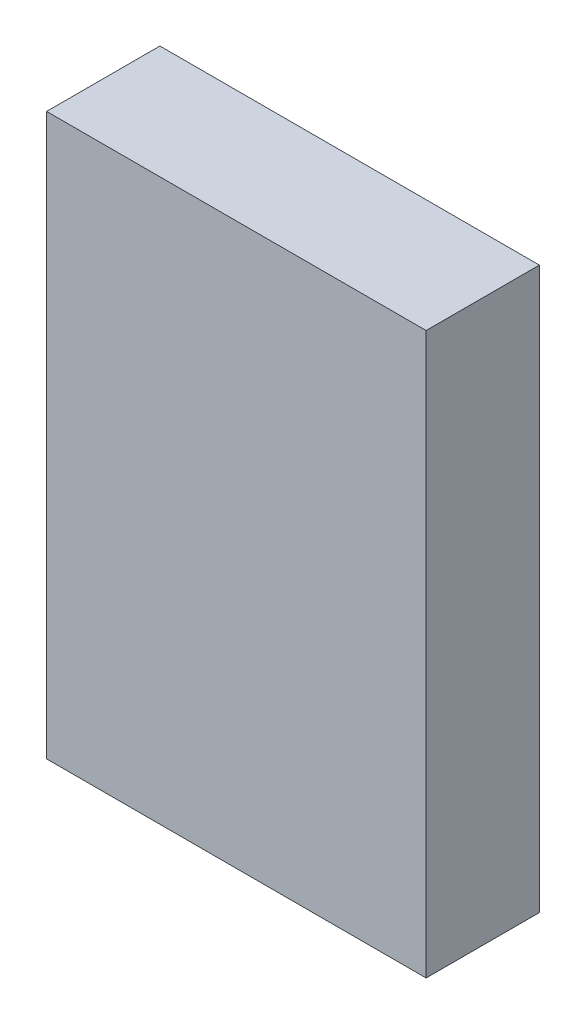
ISO-10303-21;
HEADER;
FILE_DESCRIPTION(('STEP AP214'),'2;1');
FILE_NAME('part.step','',(''),(''),'','','');
FILE_SCHEMA(('AUTOMOTIVE_DESIGN { 1 0 10303 214 1 1 1 1 }'));
ENDSEC;
DATA;
#1=APPLICATION_CONTEXT('core data for automotive mechanical design processes');
#2=APPLICATION_PROTOCOL_DEFINITION('international standard','automotive_design',2000,#1);
#3=PRODUCT_CONTEXT('',#1,'mechanical');
#4=PRODUCT('Part','Part','',(#3));
#5=PRODUCT_RELATED_PRODUCT_CATEGORY('part','',(#4));
#6=PRODUCT_DEFINITION_FORMATION('','',#4);
#7=PRODUCT_DEFINITION_CONTEXT('part definition',#1,'design');
#8=PRODUCT_DEFINITION('design','',#6,#7);
#9=PRODUCT_DEFINITION_SHAPE('','',#8);
#10=(LENGTH_UNIT() NAMED_UNIT(*) SI_UNIT(.MILLI.,.METRE.));
#11=(NAMED_UNIT(*) PLANE_ANGLE_UNIT() SI_UNIT($,.RADIAN.));
#12=(NAMED_UNIT(*) SI_UNIT($,.STERADIAN.) SOLID_ANGLE_UNIT());
#13=UNCERTAINTY_MEASURE_WITH_UNIT(LENGTH_MEASURE(1.E-05),#10,'distance_accuracy_value','');
#14=(GEOMETRIC_REPRESENTATION_CONTEXT(3) GLOBAL_UNCERTAINTY_ASSIGNED_CONTEXT((#13)) GLOBAL_UNIT_ASSIGNED_CONTEXT((#10,
#11,#12)) REPRESENTATION_CONTEXT('',''));
#15=CARTESIAN_POINT('',(0.,0.,0.));
#16=DIRECTION('',(0.,0.,1.));
#17=DIRECTION('',(1.,0.,0.));
#18=AXIS2_PLACEMENT_3D('',#15,#16,#17);
#19=CARTESIAN_POINT('',(23.72,45.32,15.5));
#20=DIRECTION('',(0.,0.,1.));
#21=DIRECTION('',(1.,0.,0.));
#22=AXIS2_PLACEMENT_3D('',#19,#20,#21);
#23=PLANE('',#22);
#24=DIRECTION('',(0.,1.,0.));
#25=VECTOR('',#24,1.);
#26=CARTESIAN_POINT('',(23.72,45.32,15.5));
#27=LINE('',#26,#25);
#28=CARTESIAN_POINT('',(23.72,45.32,15.5));
#29=VERTEX_POINT('',#28);
#30=CARTESIAN_POINT('',(23.72,94.82,15.5));
#31=VERTEX_POINT('',#30);
#32=EDGE_CURVE('E89',#29,#31,#27,.T.);
#33=ORIENTED_EDGE('',*,*,#32,.F.);
#34=DIRECTION('',(1.,0.,0.));
#35=VECTOR('',#34,1.);
#36=CARTESIAN_POINT('',(23.72,45.32,15.5));
#37=LINE('',#36,#35);
#38=CARTESIAN_POINT('',(57.22,45.32,15.5));
#39=VERTEX_POINT('',#38);
#40=EDGE_CURVE('E51',#29,#39,#37,.T.);
#41=ORIENTED_EDGE('',*,*,#40,.T.);
#42=DIRECTION('',(0.,1.,0.));
#43=VECTOR('',#42,1.);
#44=CARTESIAN_POINT('',(57.22,45.32,15.5));
#45=LINE('',#44,#43);
#46=CARTESIAN_POINT('',(57.22,94.82,15.5));
#47=VERTEX_POINT('',#46);
#48=EDGE_CURVE('E82',#39,#47,#45,.T.);
#49=ORIENTED_EDGE('',*,*,#48,.T.);
#50=DIRECTION('',(1.,0.,0.));
#51=VECTOR('',#50,1.);
#52=CARTESIAN_POINT('',(23.72,94.82,15.5));
#53=LINE('',#52,#51);
#54=EDGE_CURVE('E11',#31,#47,#53,.T.);
#55=ORIENTED_EDGE('',*,*,#54,.F.);
#56=EDGE_LOOP('',(#33,#41,#49,#55));
#57=FACE_BOUND('',#56,.T.);
#58=ADVANCED_FACE('F17',(#57),#23,.T.);
#59=CARTESIAN_POINT('',(23.72,45.32,5.5));
#60=DIRECTION('',(0.,0.,1.));
#61=DIRECTION('',(1.,0.,0.));
#62=AXIS2_PLACEMENT_3D('',#59,#60,#61);
#63=PLANE('',#62);
#64=DIRECTION('',(1.,0.,0.));
#65=VECTOR('',#64,1.);
#66=CARTESIAN_POINT('',(23.72,94.82,5.5));
#67=LINE('',#66,#65);
#68=CARTESIAN_POINT('',(23.72,94.82,5.5));
#69=VERTEX_POINT('',#68);
#70=CARTESIAN_POINT('',(57.22,94.82,5.5));
#71=VERTEX_POINT('',#70);
#72=EDGE_CURVE('E20',#69,#71,#67,.T.);
#73=ORIENTED_EDGE('',*,*,#72,.T.);
#74=DIRECTION('',(0.,1.,0.));
#75=VECTOR('',#74,1.);
#76=CARTESIAN_POINT('',(57.22,45.32,5.5));
#77=LINE('',#76,#75);
#78=CARTESIAN_POINT('',(57.22,45.32,5.5));
#79=VERTEX_POINT('',#78);
#80=EDGE_CURVE('E107',#79,#71,#77,.T.);
#81=ORIENTED_EDGE('',*,*,#80,.F.);
#82=DIRECTION('',(1.,0.,0.));
#83=VECTOR('',#82,1.);
#84=CARTESIAN_POINT('',(23.72,45.32,5.5));
#85=LINE('',#84,#83);
#86=CARTESIAN_POINT('',(23.72,45.32,5.5));
#87=VERTEX_POINT('',#86);
#88=EDGE_CURVE('E64',#87,#79,#85,.T.);
#89=ORIENTED_EDGE('',*,*,#88,.F.);
#90=DIRECTION('',(0.,1.,0.));
#91=VECTOR('',#90,1.);
#92=CARTESIAN_POINT('',(23.72,45.32,5.5));
#93=LINE('',#92,#91);
#94=EDGE_CURVE('E93',#87,#69,#93,.T.);
#95=ORIENTED_EDGE('',*,*,#94,.T.);
#96=EDGE_LOOP('',(#73,#81,#89,#95));
#97=FACE_BOUND('',#96,.T.);
#98=ADVANCED_FACE('F120',(#97),#63,.F.);
#99=CARTESIAN_POINT('',(23.72,94.82,5.5));
#100=DIRECTION('',(0.,1.,0.));
#101=DIRECTION('',(1.,0.,0.));
#102=AXIS2_PLACEMENT_3D('',#99,#100,#101);
#103=PLANE('',#102);
#104=ORIENTED_EDGE('',*,*,#72,.F.);
#105=DIRECTION('',(0.,0.,1.));
#106=VECTOR('',#105,1.);
#107=CARTESIAN_POINT('',(23.72,94.82,5.5));
#108=LINE('',#107,#106);
#109=EDGE_CURVE('E92',#69,#31,#108,.T.);
#110=ORIENTED_EDGE('',*,*,#109,.T.);
#111=ORIENTED_EDGE('',*,*,#54,.T.);
#112=DIRECTION('',(0.,0.,1.));
#113=VECTOR('',#112,1.);
#114=CARTESIAN_POINT('',(57.22,94.82,5.5));
#115=LINE('',#114,#113);
#116=EDGE_CURVE('E104',#71,#47,#115,.T.);
#117=ORIENTED_EDGE('',*,*,#116,.F.);
#118=EDGE_LOOP('',(#104,#110,#111,#117));
#119=FACE_BOUND('',#118,.T.);
#120=ADVANCED_FACE('F121',(#119),#103,.T.);
#121=CARTESIAN_POINT('',(23.72,45.32,5.5));
#122=DIRECTION('',(0.,1.,0.));
#123=DIRECTION('',(1.,0.,0.));
#124=AXIS2_PLACEMENT_3D('',#121,#122,#123);
#125=PLANE('',#124);
#126=DIRECTION('',(0.,0.,1.));
#127=VECTOR('',#126,1.);
#128=CARTESIAN_POINT('',(57.22,45.32,5.5));
#129=LINE('',#128,#127);
#130=EDGE_CURVE('E85',#79,#39,#129,.T.);
#131=ORIENTED_EDGE('',*,*,#130,.T.);
#132=ORIENTED_EDGE('',*,*,#40,.F.);
#133=DIRECTION('',(0.,0.,1.));
#134=VECTOR('',#133,1.);
#135=CARTESIAN_POINT('',(23.72,45.32,5.5));
#136=LINE('',#135,#134);
#137=EDGE_CURVE('E78',#87,#29,#136,.T.);
#138=ORIENTED_EDGE('',*,*,#137,.F.);
#139=ORIENTED_EDGE('',*,*,#88,.T.);
#140=EDGE_LOOP('',(#131,#132,#138,#139));
#141=FACE_BOUND('',#140,.T.);
#142=ADVANCED_FACE('F77',(#141),#125,.F.);
#143=CARTESIAN_POINT('',(57.22,45.32,5.5));
#144=DIRECTION('',(1.,0.,0.));
#145=DIRECTION('',(0.,1.,0.));
#146=AXIS2_PLACEMENT_3D('',#143,#144,#145);
#147=PLANE('',#146);
#148=ORIENTED_EDGE('',*,*,#130,.F.);
#149=ORIENTED_EDGE('',*,*,#80,.T.);
#150=ORIENTED_EDGE('',*,*,#116,.T.);
#151=ORIENTED_EDGE('',*,*,#48,.F.);
#152=EDGE_LOOP('',(#148,#149,#150,#151));
#153=FACE_BOUND('',#152,.T.);
#154=ADVANCED_FACE('F123',(#153),#147,.T.);
#155=CARTESIAN_POINT('',(23.72,45.32,5.5));
#156=DIRECTION('',(1.,0.,0.));
#157=DIRECTION('',(0.,1.,0.));
#158=AXIS2_PLACEMENT_3D('',#155,#156,#157);
#159=PLANE('',#158);
#160=ORIENTED_EDGE('',*,*,#32,.T.);
#161=ORIENTED_EDGE('',*,*,#109,.F.);
#162=ORIENTED_EDGE('',*,*,#94,.F.);
#163=ORIENTED_EDGE('',*,*,#137,.T.);
#164=EDGE_LOOP('',(#160,#161,#162,#163));
#165=FACE_BOUND('',#164,.T.);
#166=ADVANCED_FACE('F86',(#165),#159,.F.);
#167=CLOSED_SHELL('',(#58,#98,#120,#142,#154,#166));
#168=MANIFOLD_SOLID_BREP('B1',#167);
#169=ADVANCED_BREP_SHAPE_REPRESENTATION('',(#18,#168),#14);
#170=SHAPE_DEFINITION_REPRESENTATION(#9,#169);
ENDSEC;
END-ISO-10303-21;
